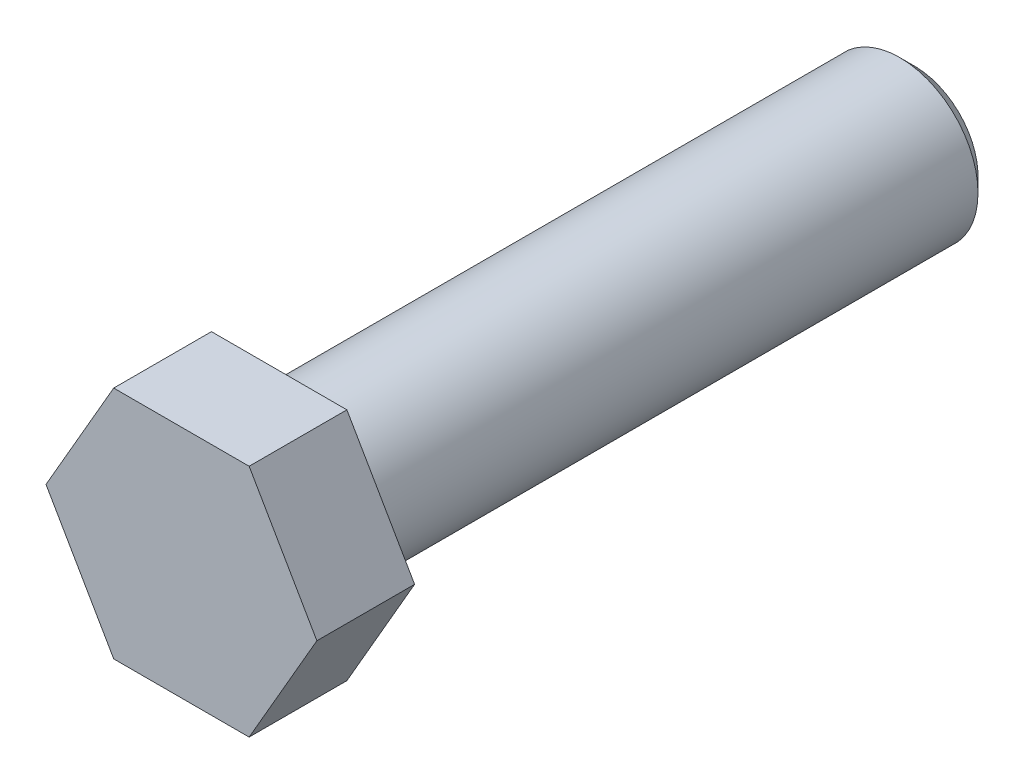
ISO-10303-21;
HEADER;
FILE_DESCRIPTION(('STEP AP214'),'2;1');
FILE_NAME('part.step','',(''),(''),'','','');
FILE_SCHEMA(('AUTOMOTIVE_DESIGN { 1 0 10303 214 1 1 1 1 }'));
ENDSEC;
DATA;
#1=APPLICATION_CONTEXT('core data for automotive mechanical design processes');
#2=APPLICATION_PROTOCOL_DEFINITION('international standard','automotive_design',2000,#1);
#3=PRODUCT_CONTEXT('',#1,'mechanical');
#4=PRODUCT('Part','Part','',(#3));
#5=PRODUCT_RELATED_PRODUCT_CATEGORY('part','',(#4));
#6=PRODUCT_DEFINITION_FORMATION('','',#4);
#7=PRODUCT_DEFINITION_CONTEXT('part definition',#1,'design');
#8=PRODUCT_DEFINITION('design','',#6,#7);
#9=PRODUCT_DEFINITION_SHAPE('','',#8);
#10=(LENGTH_UNIT() NAMED_UNIT(*) SI_UNIT(.MILLI.,.METRE.));
#11=(NAMED_UNIT(*) PLANE_ANGLE_UNIT() SI_UNIT($,.RADIAN.));
#12=(NAMED_UNIT(*) SI_UNIT($,.STERADIAN.) SOLID_ANGLE_UNIT());
#13=UNCERTAINTY_MEASURE_WITH_UNIT(LENGTH_MEASURE(1.E-05),#10,'distance_accuracy_value','');
#14=(GEOMETRIC_REPRESENTATION_CONTEXT(3) GLOBAL_UNCERTAINTY_ASSIGNED_CONTEXT((#13)) GLOBAL_UNIT_ASSIGNED_CONTEXT((#10,
#11,#12)) REPRESENTATION_CONTEXT('',''));
#15=CARTESIAN_POINT('',(0.,0.,0.));
#16=DIRECTION('',(0.,0.,1.));
#17=DIRECTION('',(1.,0.,0.));
#18=AXIS2_PLACEMENT_3D('',#15,#16,#17);
#19=CARTESIAN_POINT('',(-20.7846096908265,-12.,0.));
#20=DIRECTION('',(0.,0.,1.));
#21=DIRECTION('',(1.,0.,0.));
#22=AXIS2_PLACEMENT_3D('',#19,#20,#21);
#23=PLANE('',#22);
#24=DIRECTION('',(-0.499999999999999,-0.866025403784439,0.));
#25=VECTOR('',#24,1.);
#26=CARTESIAN_POINT('',(-6.92820323027552,12.,0.));
#27=LINE('',#26,#25);
#28=CARTESIAN_POINT('',(-6.92820323027552,12.,0.));
#29=VERTEX_POINT('',#28);
#30=CARTESIAN_POINT('',(-13.856406460551,0.,0.));
#31=VERTEX_POINT('',#30);
#32=EDGE_CURVE('E117',#29,#31,#27,.T.);
#33=ORIENTED_EDGE('',*,*,#32,.F.);
#34=DIRECTION('',(1.,0.,0.));
#35=VECTOR('',#34,1.);
#36=CARTESIAN_POINT('',(-6.92820323027552,12.,0.));
#37=LINE('',#36,#35);
#38=CARTESIAN_POINT('',(6.9282032302755,12.,0.));
#39=VERTEX_POINT('',#38);
#40=EDGE_CURVE('E127',#29,#39,#37,.T.);
#41=ORIENTED_EDGE('',*,*,#40,.T.);
#42=DIRECTION('',(0.5,-0.866025403784438,0.));
#43=VECTOR('',#42,1.);
#44=CARTESIAN_POINT('',(6.9282032302755,12.,0.));
#45=LINE('',#44,#43);
#46=CARTESIAN_POINT('',(13.856406460551,0.,0.));
#47=VERTEX_POINT('',#46);
#48=EDGE_CURVE('E125',#39,#47,#45,.T.);
#49=ORIENTED_EDGE('',*,*,#48,.T.);
#50=DIRECTION('',(-0.499999999999999,-0.866025403784439,0.));
#51=VECTOR('',#50,1.);
#52=CARTESIAN_POINT('',(13.856406460551,0.,0.));
#53=LINE('',#52,#51);
#54=CARTESIAN_POINT('',(6.92820323027551,-12.,0.));
#55=VERTEX_POINT('',#54);
#56=EDGE_CURVE('E96',#47,#55,#53,.T.);
#57=ORIENTED_EDGE('',*,*,#56,.T.);
#58=DIRECTION('',(1.,0.,0.));
#59=VECTOR('',#58,1.);
#60=CARTESIAN_POINT('',(-6.92820323027551,-12.,0.));
#61=LINE('',#60,#59);
#62=CARTESIAN_POINT('',(-6.92820323027551,-12.,0.));
#63=VERTEX_POINT('',#62);
#64=EDGE_CURVE('E121',#63,#55,#61,.T.);
#65=ORIENTED_EDGE('',*,*,#64,.F.);
#66=DIRECTION('',(0.5,-0.866025403784439,0.));
#67=VECTOR('',#66,1.);
#68=CARTESIAN_POINT('',(-13.856406460551,0.,0.));
#69=LINE('',#68,#67);
#70=EDGE_CURVE('E119',#31,#63,#69,.T.);
#71=ORIENTED_EDGE('',*,*,#70,.F.);
#72=EDGE_LOOP('',(#33,#41,#49,#57,#65,#71));
#73=FACE_BOUND('',#72,.T.);
#74=CARTESIAN_POINT('',(0.,0.,0.));
#75=DIRECTION('',(0.,0.,1.));
#76=DIRECTION('',(1.,0.,0.));
#77=AXIS2_PLACEMENT_3D('',#74,#75,#76);
#78=CIRCLE('',#77,8.);
#79=CARTESIAN_POINT('',(8.,0.,0.));
#80=VERTEX_POINT('',#79);
#81=EDGE_CURVE('E139',#80,#80,#78,.F.);
#82=ORIENTED_EDGE('',*,*,#81,.F.);
#83=EDGE_LOOP('',(#82));
#84=FACE_BOUND('',#83,.T.);
#85=ADVANCED_FACE('F31',(#73,#84),#23,.F.);
#86=CARTESIAN_POINT('',(-6.92820323027552,12.,10.));
#87=DIRECTION('',(0.866025403784439,-0.499999999999999,0.));
#88=DIRECTION('',(0.499999999999999,0.866025403784439,0.));
#89=AXIS2_PLACEMENT_3D('',#86,#87,#88);
#90=PLANE('',#89);
#91=ORIENTED_EDGE('',*,*,#32,.T.);
#92=DIRECTION('',(0.,0.,-1.));
#93=VECTOR('',#92,1.);
#94=CARTESIAN_POINT('',(-13.856406460551,0.,10.));
#95=LINE('',#94,#93);
#96=CARTESIAN_POINT('',(-13.856406460551,0.,10.));
#97=VERTEX_POINT('',#96);
#98=EDGE_CURVE('E137',#97,#31,#95,.T.);
#99=ORIENTED_EDGE('',*,*,#98,.F.);
#100=DIRECTION('',(-0.499999999999999,-0.866025403784439,0.));
#101=VECTOR('',#100,1.);
#102=CARTESIAN_POINT('',(-6.92820323027552,12.,10.));
#103=LINE('',#102,#101);
#104=CARTESIAN_POINT('',(-6.92820323027552,12.,10.));
#105=VERTEX_POINT('',#104);
#106=EDGE_CURVE('E130',#105,#97,#103,.T.);
#107=ORIENTED_EDGE('',*,*,#106,.F.);
#108=DIRECTION('',(0.,0.,-1.));
#109=VECTOR('',#108,1.);
#110=CARTESIAN_POINT('',(-6.92820323027552,12.,10.));
#111=LINE('',#110,#109);
#112=EDGE_CURVE('E48',#105,#29,#111,.T.);
#113=ORIENTED_EDGE('',*,*,#112,.T.);
#114=EDGE_LOOP('',(#91,#99,#107,#113));
#115=FACE_BOUND('',#114,.T.);
#116=ADVANCED_FACE('F155',(#115),#90,.F.);
#117=CARTESIAN_POINT('',(-13.856406460551,0.,10.));
#118=DIRECTION('',(0.866025403784439,0.5,0.));
#119=DIRECTION('',(-0.5,0.866025403784439,0.));
#120=AXIS2_PLACEMENT_3D('',#117,#118,#119);
#121=PLANE('',#120);
#122=ORIENTED_EDGE('',*,*,#70,.T.);
#123=DIRECTION('',(0.,0.,-1.));
#124=VECTOR('',#123,1.);
#125=CARTESIAN_POINT('',(-6.92820323027551,-12.,10.));
#126=LINE('',#125,#124);
#127=CARTESIAN_POINT('',(-6.92820323027551,-12.,10.));
#128=VERTEX_POINT('',#127);
#129=EDGE_CURVE('E134',#128,#63,#126,.T.);
#130=ORIENTED_EDGE('',*,*,#129,.F.);
#131=DIRECTION('',(0.5,-0.866025403784439,0.));
#132=VECTOR('',#131,1.);
#133=CARTESIAN_POINT('',(-13.856406460551,0.,10.));
#134=LINE('',#133,#132);
#135=EDGE_CURVE('E81',#97,#128,#134,.T.);
#136=ORIENTED_EDGE('',*,*,#135,.F.);
#137=ORIENTED_EDGE('',*,*,#98,.T.);
#138=EDGE_LOOP('',(#122,#130,#136,#137));
#139=FACE_BOUND('',#138,.T.);
#140=ADVANCED_FACE('F161',(#139),#121,.F.);
#141=CARTESIAN_POINT('',(-6.92820323027551,-12.,10.));
#142=DIRECTION('',(0.,1.,0.));
#143=DIRECTION('',(0.,0.,1.));
#144=AXIS2_PLACEMENT_3D('',#141,#142,#143);
#145=PLANE('',#144);
#146=ORIENTED_EDGE('',*,*,#64,.T.);
#147=DIRECTION('',(0.,0.,-1.));
#148=VECTOR('',#147,1.);
#149=CARTESIAN_POINT('',(6.92820323027551,-12.,10.));
#150=LINE('',#149,#148);
#151=CARTESIAN_POINT('',(6.92820323027551,-12.,10.));
#152=VERTEX_POINT('',#151);
#153=EDGE_CURVE('E100',#152,#55,#150,.T.);
#154=ORIENTED_EDGE('',*,*,#153,.F.);
#155=DIRECTION('',(1.,0.,0.));
#156=VECTOR('',#155,1.);
#157=CARTESIAN_POINT('',(-6.92820323027551,-12.,10.));
#158=LINE('',#157,#156);
#159=EDGE_CURVE('E108',#128,#152,#158,.T.);
#160=ORIENTED_EDGE('',*,*,#159,.F.);
#161=ORIENTED_EDGE('',*,*,#129,.T.);
#162=EDGE_LOOP('',(#146,#154,#160,#161));
#163=FACE_BOUND('',#162,.T.);
#164=ADVANCED_FACE('F173',(#163),#145,.F.);
#165=CARTESIAN_POINT('',(13.856406460551,0.,10.));
#166=DIRECTION('',(0.866025403784439,-0.499999999999999,0.));
#167=DIRECTION('',(0.499999999999999,0.866025403784439,0.));
#168=AXIS2_PLACEMENT_3D('',#165,#166,#167);
#169=PLANE('',#168);
#170=ORIENTED_EDGE('',*,*,#56,.F.);
#171=DIRECTION('',(0.,0.,-1.));
#172=VECTOR('',#171,1.);
#173=CARTESIAN_POINT('',(13.856406460551,0.,10.));
#174=LINE('',#173,#172);
#175=CARTESIAN_POINT('',(13.856406460551,0.,10.));
#176=VERTEX_POINT('',#175);
#177=EDGE_CURVE('E91',#176,#47,#174,.T.);
#178=ORIENTED_EDGE('',*,*,#177,.F.);
#179=DIRECTION('',(-0.499999999999999,-0.866025403784439,0.));
#180=VECTOR('',#179,1.);
#181=CARTESIAN_POINT('',(13.856406460551,0.,10.));
#182=LINE('',#181,#180);
#183=EDGE_CURVE('E94',#176,#152,#182,.T.);
#184=ORIENTED_EDGE('',*,*,#183,.T.);
#185=ORIENTED_EDGE('',*,*,#153,.T.);
#186=EDGE_LOOP('',(#170,#178,#184,#185));
#187=FACE_BOUND('',#186,.T.);
#188=ADVANCED_FACE('F93',(#187),#169,.T.);
#189=CARTESIAN_POINT('',(6.9282032302755,12.,10.));
#190=DIRECTION('',(0.866025403784438,0.5,0.));
#191=DIRECTION('',(-0.5,0.866025403784438,0.));
#192=AXIS2_PLACEMENT_3D('',#189,#190,#191);
#193=PLANE('',#192);
#194=ORIENTED_EDGE('',*,*,#48,.F.);
#195=DIRECTION('',(0.,0.,-1.));
#196=VECTOR('',#195,1.);
#197=CARTESIAN_POINT('',(6.9282032302755,12.,10.));
#198=LINE('',#197,#196);
#199=CARTESIAN_POINT('',(6.9282032302755,12.,10.));
#200=VERTEX_POINT('',#199);
#201=EDGE_CURVE('E68',#200,#39,#198,.T.);
#202=ORIENTED_EDGE('',*,*,#201,.F.);
#203=DIRECTION('',(0.5,-0.866025403784438,0.));
#204=VECTOR('',#203,1.);
#205=CARTESIAN_POINT('',(6.9282032302755,12.,10.));
#206=LINE('',#205,#204);
#207=EDGE_CURVE('E106',#200,#176,#206,.T.);
#208=ORIENTED_EDGE('',*,*,#207,.T.);
#209=ORIENTED_EDGE('',*,*,#177,.T.);
#210=EDGE_LOOP('',(#194,#202,#208,#209));
#211=FACE_BOUND('',#210,.T.);
#212=ADVANCED_FACE('F111',(#211),#193,.T.);
#213=CARTESIAN_POINT('',(-6.92820323027552,12.,10.));
#214=DIRECTION('',(0.,1.,0.));
#215=DIRECTION('',(0.,0.,1.));
#216=AXIS2_PLACEMENT_3D('',#213,#214,#215);
#217=PLANE('',#216);
#218=ORIENTED_EDGE('',*,*,#40,.F.);
#219=ORIENTED_EDGE('',*,*,#112,.F.);
#220=DIRECTION('',(1.,0.,0.));
#221=VECTOR('',#220,1.);
#222=CARTESIAN_POINT('',(-6.92820323027552,12.,10.));
#223=LINE('',#222,#221);
#224=EDGE_CURVE('E112',#105,#200,#223,.T.);
#225=ORIENTED_EDGE('',*,*,#224,.T.);
#226=ORIENTED_EDGE('',*,*,#201,.T.);
#227=EDGE_LOOP('',(#218,#219,#225,#226));
#228=FACE_BOUND('',#227,.T.);
#229=ADVANCED_FACE('F166',(#228),#217,.T.);
#230=CARTESIAN_POINT('',(-20.7846096908265,-12.,10.));
#231=DIRECTION('',(0.,0.,1.));
#232=DIRECTION('',(1.,0.,0.));
#233=AXIS2_PLACEMENT_3D('',#230,#231,#232);
#234=PLANE('',#233);
#235=ORIENTED_EDGE('',*,*,#106,.T.);
#236=ORIENTED_EDGE('',*,*,#135,.T.);
#237=ORIENTED_EDGE('',*,*,#159,.T.);
#238=ORIENTED_EDGE('',*,*,#183,.F.);
#239=ORIENTED_EDGE('',*,*,#207,.F.);
#240=ORIENTED_EDGE('',*,*,#224,.F.);
#241=EDGE_LOOP('',(#235,#236,#237,#238,#239,#240));
#242=FACE_BOUND('',#241,.T.);
#243=ADVANCED_FACE('F104',(#242),#234,.T.);
#244=CARTESIAN_POINT('',(0.,0.,-65.));
#245=DIRECTION('',(0.,0.,1.));
#246=DIRECTION('',(1.,0.,0.));
#247=AXIS2_PLACEMENT_3D('',#244,#245,#246);
#248=CYLINDRICAL_SURFACE('',#247,8.);
#249=CARTESIAN_POINT('',(0.,0.,-63.5));
#250=DIRECTION('',(0.,0.,-1.));
#251=DIRECTION('',(-1.,0.,0.));
#252=AXIS2_PLACEMENT_3D('',#249,#250,#251);
#253=CIRCLE('',#252,8.);
#254=CARTESIAN_POINT('',(-8.,0.,-63.5));
#255=VERTEX_POINT('',#254);
#256=EDGE_CURVE('E11',#255,#255,#253,.F.);
#257=ORIENTED_EDGE('',*,*,#256,.T.);
#258=EDGE_LOOP('',(#257));
#259=FACE_BOUND('',#258,.T.);
#260=ORIENTED_EDGE('',*,*,#81,.T.);
#261=EDGE_LOOP('',(#260));
#262=FACE_BOUND('',#261,.T.);
#263=ADVANCED_FACE('F151',(#259,#262),#248,.T.);
#264=CARTESIAN_POINT('',(0.,0.,-65.));
#265=DIRECTION('',(0.,0.,-1.));
#266=DIRECTION('',(-1.,0.,0.));
#267=AXIS2_PLACEMENT_3D('',#264,#265,#266);
#268=PLANE('',#267);
#269=CARTESIAN_POINT('',(0.,0.,-65.));
#270=DIRECTION('',(0.,0.,-1.));
#271=DIRECTION('',(-1.,0.,0.));
#272=AXIS2_PLACEMENT_3D('',#269,#270,#271);
#273=CIRCLE('',#272,6.49999999999997);
#274=CARTESIAN_POINT('',(-6.49999999999997,0.,-65.));
#275=VERTEX_POINT('',#274);
#276=EDGE_CURVE('E40',#275,#275,#273,.T.);
#277=ORIENTED_EDGE('',*,*,#276,.T.);
#278=EDGE_LOOP('',(#277));
#279=FACE_BOUND('',#278,.T.);
#280=ADVANCED_FACE('F144',(#279),#268,.T.);
#281=CARTESIAN_POINT('',(0.,0.,-65.));
#282=DIRECTION('',(0.,0.,1.));
#283=DIRECTION('',(1.,0.,0.));
#284=AXIS2_PLACEMENT_3D('',#281,#282,#283);
#285=CONICAL_SURFACE('',#284,6.49999999999997,0.785398163397452);
#286=ORIENTED_EDGE('',*,*,#256,.F.);
#287=EDGE_LOOP('',(#286));
#288=FACE_BOUND('',#287,.T.);
#289=ORIENTED_EDGE('',*,*,#276,.F.);
#290=EDGE_LOOP('',(#289));
#291=FACE_BOUND('',#290,.T.);
#292=ADVANCED_FACE('F33',(#288,#291),#285,.T.);
#293=CLOSED_SHELL('',(#85,#116,#140,#164,#188,#212,#229,#243,#263,#280,#292));
#294=MANIFOLD_SOLID_BREP('B2',#293);
#295=ADVANCED_BREP_SHAPE_REPRESENTATION('',(#18,#294),#14);
#296=SHAPE_DEFINITION_REPRESENTATION(#9,#295);
ENDSEC;
END-ISO-10303-21;
